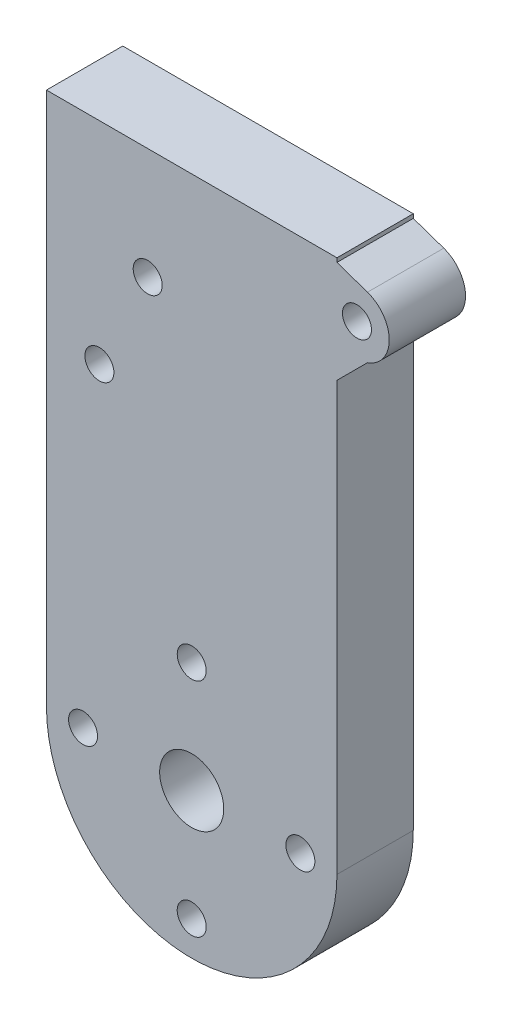
ISO-10303-21;
HEADER;
FILE_DESCRIPTION(('STEP AP214'),'2;1');
FILE_NAME('part.step','',(''),(''),'','','');
FILE_SCHEMA(('AUTOMOTIVE_DESIGN { 1 0 10303 214 1 1 1 1 }'));
ENDSEC;
DATA;
#1=APPLICATION_CONTEXT('core data for automotive mechanical design processes');
#2=APPLICATION_PROTOCOL_DEFINITION('international standard','automotive_design',2000,#1);
#3=PRODUCT_CONTEXT('',#1,'mechanical');
#4=PRODUCT('Part','Part','',(#3));
#5=PRODUCT_RELATED_PRODUCT_CATEGORY('part','',(#4));
#6=PRODUCT_DEFINITION_FORMATION('','',#4);
#7=PRODUCT_DEFINITION_CONTEXT('part definition',#1,'design');
#8=PRODUCT_DEFINITION('design','',#6,#7);
#9=PRODUCT_DEFINITION_SHAPE('','',#8);
#10=(LENGTH_UNIT() NAMED_UNIT(*) SI_UNIT(.MILLI.,.METRE.));
#11=(NAMED_UNIT(*) PLANE_ANGLE_UNIT() SI_UNIT($,.RADIAN.));
#12=(NAMED_UNIT(*) SI_UNIT($,.STERADIAN.) SOLID_ANGLE_UNIT());
#13=UNCERTAINTY_MEASURE_WITH_UNIT(LENGTH_MEASURE(1.E-05),#10,'distance_accuracy_value','');
#14=(GEOMETRIC_REPRESENTATION_CONTEXT(3) GLOBAL_UNCERTAINTY_ASSIGNED_CONTEXT((#13)) GLOBAL_UNIT_ASSIGNED_CONTEXT((#10,
#11,#12)) REPRESENTATION_CONTEXT('',''));
#15=CARTESIAN_POINT('',(0.,0.,0.));
#16=DIRECTION('',(0.,0.,1.));
#17=DIRECTION('',(1.,0.,0.));
#18=AXIS2_PLACEMENT_3D('',#15,#16,#17);
#19=CARTESIAN_POINT('',(-12.0999191944856,42.352384866158,10.));
#20=DIRECTION('',(0.,0.,-1.));
#21=DIRECTION('',(-1.,0.,0.));
#22=AXIS2_PLACEMENT_3D('',#19,#20,#21);
#23=CYLINDRICAL_SURFACE('',#22,1.9);
#24=CARTESIAN_POINT('',(-12.0999191944856,42.352384866158,10.));
#25=DIRECTION('',(0.,0.,1.));
#26=DIRECTION('',(1.,0.,0.));
#27=AXIS2_PLACEMENT_3D('',#24,#25,#26);
#28=CIRCLE('',#27,1.9);
#29=CARTESIAN_POINT('',(-10.1999191944856,42.352384866158,10.));
#30=VERTEX_POINT('',#29);
#31=EDGE_CURVE('E237',#30,#30,#28,.T.);
#32=ORIENTED_EDGE('',*,*,#31,.T.);
#33=EDGE_LOOP('',(#32));
#34=FACE_BOUND('',#33,.T.);
#35=CARTESIAN_POINT('',(-12.0999191944856,42.352384866158,2.));
#36=DIRECTION('',(0.,0.,-1.));
#37=DIRECTION('',(-1.,0.,0.));
#38=AXIS2_PLACEMENT_3D('',#35,#36,#37);
#39=CIRCLE('',#38,1.9);
#40=CARTESIAN_POINT('',(-13.9999191944856,42.352384866158,2.));
#41=VERTEX_POINT('',#40);
#42=EDGE_CURVE('E49',#41,#41,#39,.T.);
#43=ORIENTED_EDGE('',*,*,#42,.T.);
#44=EDGE_LOOP('',(#43));
#45=FACE_BOUND('',#44,.T.);
#46=ADVANCED_FACE('F45',(#34,#45),#23,.F.);
#47=CARTESIAN_POINT('',(-5.77203667010349,55.3987599472915,10.));
#48=DIRECTION('',(0.,0.,-1.));
#49=DIRECTION('',(-1.,0.,0.));
#50=AXIS2_PLACEMENT_3D('',#47,#48,#49);
#51=CYLINDRICAL_SURFACE('',#50,1.9);
#52=CARTESIAN_POINT('',(-5.77203667010349,55.3987599472915,10.));
#53=DIRECTION('',(0.,0.,1.));
#54=DIRECTION('',(1.,0.,0.));
#55=AXIS2_PLACEMENT_3D('',#52,#53,#54);
#56=CIRCLE('',#55,1.9);
#57=CARTESIAN_POINT('',(-3.87203667010349,55.3987599472915,10.));
#58=VERTEX_POINT('',#57);
#59=EDGE_CURVE('E233',#58,#58,#56,.T.);
#60=ORIENTED_EDGE('',*,*,#59,.T.);
#61=EDGE_LOOP('',(#60));
#62=FACE_BOUND('',#61,.T.);
#63=CARTESIAN_POINT('',(-5.77203667010349,55.3987599472915,2.));
#64=DIRECTION('',(0.,0.,-1.));
#65=DIRECTION('',(-1.,0.,0.));
#66=AXIS2_PLACEMENT_3D('',#63,#64,#65);
#67=CIRCLE('',#66,1.9);
#68=CARTESIAN_POINT('',(-7.6720366701035,55.3987599472915,2.));
#69=VERTEX_POINT('',#68);
#70=EDGE_CURVE('E194',#69,#69,#67,.T.);
#71=ORIENTED_EDGE('',*,*,#70,.T.);
#72=EDGE_LOOP('',(#71));
#73=FACE_BOUND('',#72,.T.);
#74=ADVANCED_FACE('F329',(#62,#73),#51,.F.);
#75=CARTESIAN_POINT('',(0.,0.,10.));
#76=DIRECTION('',(0.,0.,1.));
#77=DIRECTION('',(1.,0.,0.));
#78=AXIS2_PLACEMENT_3D('',#75,#76,#77);
#79=PLANE('',#78);
#80=ORIENTED_EDGE('',*,*,#31,.F.);
#81=EDGE_LOOP('',(#80));
#82=FACE_BOUND('',#81,.T.);
#83=CARTESIAN_POINT('',(0.,14.5378546269567,10.));
#84=DIRECTION('',(0.,0.,1.));
#85=DIRECTION('',(-1.,0.,0.));
#86=AXIS2_PLACEMENT_3D('',#83,#84,#85);
#87=CIRCLE('',#86,1.9);
#88=CARTESIAN_POINT('',(-1.89999999999998,14.5378546269567,10.));
#89=VERTEX_POINT('',#88);
#90=EDGE_CURVE('E250',#89,#89,#87,.T.);
#91=ORIENTED_EDGE('',*,*,#90,.F.);
#92=EDGE_LOOP('',(#91));
#93=FACE_BOUND('',#92,.T.);
#94=CARTESIAN_POINT('',(14.2426697614347,0.,10.));
#95=DIRECTION('',(0.,0.,1.));
#96=DIRECTION('',(-1.,0.,0.));
#97=AXIS2_PLACEMENT_3D('',#94,#95,#96);
#98=CIRCLE('',#97,1.9);
#99=CARTESIAN_POINT('',(12.3426697614347,0.,10.));
#100=VERTEX_POINT('',#99);
#101=EDGE_CURVE('E266',#100,#100,#98,.T.);
#102=ORIENTED_EDGE('',*,*,#101,.F.);
#103=EDGE_LOOP('',(#102));
#104=FACE_BOUND('',#103,.T.);
#105=CARTESIAN_POINT('',(-14.2426697614347,0.,10.));
#106=DIRECTION('',(0.,0.,1.));
#107=DIRECTION('',(1.,0.,0.));
#108=AXIS2_PLACEMENT_3D('',#105,#106,#107);
#109=CIRCLE('',#108,1.9);
#110=CARTESIAN_POINT('',(-12.3426697614347,0.,10.));
#111=VERTEX_POINT('',#110);
#112=EDGE_CURVE('E156',#111,#111,#109,.T.);
#113=ORIENTED_EDGE('',*,*,#112,.F.);
#114=EDGE_LOOP('',(#113));
#115=FACE_BOUND('',#114,.T.);
#116=CARTESIAN_POINT('',(0.,0.,10.));
#117=DIRECTION('',(0.,0.,1.));
#118=DIRECTION('',(1.,0.,0.));
#119=AXIS2_PLACEMENT_3D('',#116,#117,#118);
#120=CIRCLE('',#119,19.0388517538793);
#121=CARTESIAN_POINT('',(-19.0388517538793,0.,10.));
#122=VERTEX_POINT('',#121);
#123=CARTESIAN_POINT('',(19.0388517538793,0.,10.));
#124=VERTEX_POINT('',#123);
#125=EDGE_CURVE('E174',#122,#124,#120,.T.);
#126=ORIENTED_EDGE('',*,*,#125,.T.);
#127=DIRECTION('',(0.,1.,0.));
#128=VECTOR('',#127,1.);
#129=CARTESIAN_POINT('',(19.0388517538793,0.,10.));
#130=LINE('',#129,#128);
#131=CARTESIAN_POINT('',(19.0388517538793,56.0913366061646,10.));
#132=VERTEX_POINT('',#131);
#133=EDGE_CURVE('E109',#124,#132,#130,.T.);
#134=ORIENTED_EDGE('',*,*,#133,.T.);
#135=DIRECTION('',(0.707106781186539,0.707106781186556,0.));
#136=VECTOR('',#135,1.);
#137=CARTESIAN_POINT('',(23.0388517538793,60.0913366061647,10.));
#138=LINE('',#137,#136);
#139=CARTESIAN_POINT('',(23.0388517538793,60.0913366061647,10.));
#140=VERTEX_POINT('',#139);
#141=EDGE_CURVE('E291',#132,#140,#138,.T.);
#142=ORIENTED_EDGE('',*,*,#141,.T.);
#143=CARTESIAN_POINT('',(21.6608912166757,64.0913366061647,10.));
#144=DIRECTION('',(0.,0.,1.));
#145=DIRECTION('',(-1.,0.,0.));
#146=AXIS2_PLACEMENT_3D('',#143,#144,#145);
#147=CIRCLE('',#146,4.2306944160611);
#148=CARTESIAN_POINT('',(23.0388517538793,68.0913366061647,10.));
#149=VERTEX_POINT('',#148);
#150=EDGE_CURVE('E294',#140,#149,#147,.T.);
#151=ORIENTED_EDGE('',*,*,#150,.T.);
#152=DIRECTION('',(-0.945471264673407,0.32570552294499,0.));
#153=VECTOR('',#152,1.);
#154=CARTESIAN_POINT('',(19.0388517538793,69.4692971433683,10.));
#155=LINE('',#154,#153);
#156=CARTESIAN_POINT('',(19.0388517538793,69.4692971433683,10.));
#157=VERTEX_POINT('',#156);
#158=EDGE_CURVE('E129',#149,#157,#155,.T.);
#159=ORIENTED_EDGE('',*,*,#158,.T.);
#160=DIRECTION('',(0.,1.,0.));
#161=VECTOR('',#160,1.);
#162=CARTESIAN_POINT('',(19.0388517538793,69.4692971433683,10.));
#163=LINE('',#162,#161);
#164=CARTESIAN_POINT('',(19.0388517538793,70.,10.));
#165=VERTEX_POINT('',#164);
#166=EDGE_CURVE('E122',#157,#165,#163,.T.);
#167=ORIENTED_EDGE('',*,*,#166,.T.);
#168=DIRECTION('',(-1.,0.,0.));
#169=VECTOR('',#168,1.);
#170=CARTESIAN_POINT('',(19.0388517538793,70.,10.));
#171=LINE('',#170,#169);
#172=CARTESIAN_POINT('',(-19.0388517538793,70.,10.));
#173=VERTEX_POINT('',#172);
#174=EDGE_CURVE('E127',#165,#173,#171,.T.);
#175=ORIENTED_EDGE('',*,*,#174,.T.);
#176=DIRECTION('',(0.,-1.,0.));
#177=VECTOR('',#176,1.);
#178=CARTESIAN_POINT('',(-19.0388517538793,0.,10.));
#179=LINE('',#178,#177);
#180=EDGE_CURVE('E65',#173,#122,#179,.T.);
#181=ORIENTED_EDGE('',*,*,#180,.T.);
#182=EDGE_LOOP('',(#126,#134,#142,#151,#159,#167,#175,#181));
#183=FACE_BOUND('',#182,.T.);
#184=CARTESIAN_POINT('',(0.,0.,10.));
#185=DIRECTION('',(0.,0.,1.));
#186=DIRECTION('',(1.,0.,0.));
#187=AXIS2_PLACEMENT_3D('',#184,#185,#186);
#188=CIRCLE('',#187,4.2);
#189=CARTESIAN_POINT('',(4.2,0.,10.));
#190=VERTEX_POINT('',#189);
#191=EDGE_CURVE('E270',#190,#190,#188,.T.);
#192=ORIENTED_EDGE('',*,*,#191,.F.);
#193=EDGE_LOOP('',(#192));
#194=FACE_BOUND('',#193,.T.);
#195=CARTESIAN_POINT('',(0.,-14.5378546269567,10.));
#196=DIRECTION('',(0.,0.,1.));
#197=DIRECTION('',(1.,0.,0.));
#198=AXIS2_PLACEMENT_3D('',#195,#196,#197);
#199=CIRCLE('',#198,1.9);
#200=CARTESIAN_POINT('',(1.9,-14.5378546269567,10.));
#201=VERTEX_POINT('',#200);
#202=EDGE_CURVE('E258',#201,#201,#199,.T.);
#203=ORIENTED_EDGE('',*,*,#202,.F.);
#204=EDGE_LOOP('',(#203));
#205=FACE_BOUND('',#204,.T.);
#206=CARTESIAN_POINT('',(21.6608912166757,64.0913366061647,10.));
#207=DIRECTION('',(0.,0.,1.));
#208=DIRECTION('',(1.,0.,0.));
#209=AXIS2_PLACEMENT_3D('',#206,#207,#208);
#210=CIRCLE('',#209,1.9);
#211=CARTESIAN_POINT('',(23.5608912166757,64.0913366061647,10.));
#212=VERTEX_POINT('',#211);
#213=EDGE_CURVE('E242',#212,#212,#210,.T.);
#214=ORIENTED_EDGE('',*,*,#213,.F.);
#215=EDGE_LOOP('',(#214));
#216=FACE_BOUND('',#215,.T.);
#217=ORIENTED_EDGE('',*,*,#59,.F.);
#218=EDGE_LOOP('',(#217));
#219=FACE_BOUND('',#218,.T.);
#220=ADVANCED_FACE('F124',(#82,#93,#104,#115,#183,#194,#205,#216,#219),#79,.T.);
#221=CARTESIAN_POINT('',(0.,0.,0.));
#222=DIRECTION('',(0.,0.,1.));
#223=DIRECTION('',(1.,0.,0.));
#224=AXIS2_PLACEMENT_3D('',#221,#222,#223);
#225=PLANE('',#224);
#226=CARTESIAN_POINT('',(-12.0999191944856,42.352384866158,0.));
#227=DIRECTION('',(0.,0.,-1.));
#228=DIRECTION('',(-1.,0.,0.));
#229=AXIS2_PLACEMENT_3D('',#226,#227,#228);
#230=CIRCLE('',#229,2.9);
#231=CARTESIAN_POINT('',(-14.9999191944856,42.352384866158,0.));
#232=VERTEX_POINT('',#231);
#233=EDGE_CURVE('E205',#232,#232,#230,.T.);
#234=ORIENTED_EDGE('',*,*,#233,.F.);
#235=EDGE_LOOP('',(#234));
#236=FACE_BOUND('',#235,.T.);
#237=CARTESIAN_POINT('',(-5.77203667010349,55.3987599472915,0.));
#238=DIRECTION('',(0.,0.,-1.));
#239=DIRECTION('',(-1.,0.,0.));
#240=AXIS2_PLACEMENT_3D('',#237,#238,#239);
#241=CIRCLE('',#240,2.9);
#242=CARTESIAN_POINT('',(-8.67203667010349,55.3987599472915,0.));
#243=VERTEX_POINT('',#242);
#244=EDGE_CURVE('E211',#243,#243,#241,.T.);
#245=ORIENTED_EDGE('',*,*,#244,.F.);
#246=EDGE_LOOP('',(#245));
#247=FACE_BOUND('',#246,.T.);
#248=CARTESIAN_POINT('',(0.,0.,0.));
#249=DIRECTION('',(0.,0.,1.));
#250=DIRECTION('',(1.,0.,0.));
#251=AXIS2_PLACEMENT_3D('',#248,#249,#250);
#252=CIRCLE('',#251,12.);
#253=CARTESIAN_POINT('',(12.,0.,0.));
#254=VERTEX_POINT('',#253);
#255=EDGE_CURVE('E11',#254,#254,#252,.F.);
#256=ORIENTED_EDGE('',*,*,#255,.F.);
#257=EDGE_LOOP('',(#256));
#258=FACE_BOUND('',#257,.T.);
#259=CARTESIAN_POINT('',(0.,0.,0.));
#260=DIRECTION('',(0.,0.,1.));
#261=DIRECTION('',(1.,0.,0.));
#262=AXIS2_PLACEMENT_3D('',#259,#260,#261);
#263=CIRCLE('',#262,19.0388517538793);
#264=CARTESIAN_POINT('',(-19.0388517538793,0.,0.));
#265=VERTEX_POINT('',#264);
#266=CARTESIAN_POINT('',(19.0388517538793,0.,0.));
#267=VERTEX_POINT('',#266);
#268=EDGE_CURVE('E151',#265,#267,#263,.T.);
#269=ORIENTED_EDGE('',*,*,#268,.F.);
#270=DIRECTION('',(0.,-1.,0.));
#271=VECTOR('',#270,1.);
#272=CARTESIAN_POINT('',(-19.0388517538793,0.,0.));
#273=LINE('',#272,#271);
#274=CARTESIAN_POINT('',(-19.0388517538793,70.,0.));
#275=VERTEX_POINT('',#274);
#276=EDGE_CURVE('E100',#275,#265,#273,.T.);
#277=ORIENTED_EDGE('',*,*,#276,.F.);
#278=DIRECTION('',(-1.,0.,0.));
#279=VECTOR('',#278,1.);
#280=CARTESIAN_POINT('',(19.0388517538793,70.,0.));
#281=LINE('',#280,#279);
#282=CARTESIAN_POINT('',(19.0388517538793,70.,0.));
#283=VERTEX_POINT('',#282);
#284=EDGE_CURVE('E94',#283,#275,#281,.T.);
#285=ORIENTED_EDGE('',*,*,#284,.F.);
#286=DIRECTION('',(0.,1.,0.));
#287=VECTOR('',#286,1.);
#288=CARTESIAN_POINT('',(19.0388517538793,69.4692971433683,0.));
#289=LINE('',#288,#287);
#290=CARTESIAN_POINT('',(19.0388517538793,69.4692971433683,0.));
#291=VERTEX_POINT('',#290);
#292=EDGE_CURVE('E138',#291,#283,#289,.T.);
#293=ORIENTED_EDGE('',*,*,#292,.F.);
#294=DIRECTION('',(-0.945471264673407,0.32570552294499,0.));
#295=VECTOR('',#294,1.);
#296=CARTESIAN_POINT('',(19.0388517538793,69.4692971433683,0.));
#297=LINE('',#296,#295);
#298=CARTESIAN_POINT('',(23.0388517538793,68.0913366061647,0.));
#299=VERTEX_POINT('',#298);
#300=EDGE_CURVE('E165',#299,#291,#297,.T.);
#301=ORIENTED_EDGE('',*,*,#300,.F.);
#302=CARTESIAN_POINT('',(21.6608912166757,64.0913366061647,0.));
#303=DIRECTION('',(0.,0.,1.));
#304=DIRECTION('',(-1.,0.,0.));
#305=AXIS2_PLACEMENT_3D('',#302,#303,#304);
#306=CIRCLE('',#305,4.2306944160611);
#307=CARTESIAN_POINT('',(23.0388517538793,60.0913366061647,0.));
#308=VERTEX_POINT('',#307);
#309=EDGE_CURVE('E162',#308,#299,#306,.T.);
#310=ORIENTED_EDGE('',*,*,#309,.F.);
#311=DIRECTION('',(0.707106781186539,0.707106781186556,0.));
#312=VECTOR('',#311,1.);
#313=CARTESIAN_POINT('',(23.0388517538793,60.0913366061647,0.));
#314=LINE('',#313,#312);
#315=CARTESIAN_POINT('',(19.0388517538793,56.0913366061646,0.));
#316=VERTEX_POINT('',#315);
#317=EDGE_CURVE('E159',#316,#308,#314,.T.);
#318=ORIENTED_EDGE('',*,*,#317,.F.);
#319=DIRECTION('',(0.,1.,0.));
#320=VECTOR('',#319,1.);
#321=CARTESIAN_POINT('',(19.0388517538793,0.,0.));
#322=LINE('',#321,#320);
#323=EDGE_CURVE('E155',#267,#316,#322,.T.);
#324=ORIENTED_EDGE('',*,*,#323,.F.);
#325=EDGE_LOOP('',(#269,#277,#285,#293,#301,#310,#318,#324));
#326=FACE_BOUND('',#325,.T.);
#327=CARTESIAN_POINT('',(-14.2426697614347,0.,0.));
#328=DIRECTION('',(0.,0.,1.));
#329=DIRECTION('',(1.,0.,0.));
#330=AXIS2_PLACEMENT_3D('',#327,#328,#329);
#331=CIRCLE('',#330,1.9);
#332=CARTESIAN_POINT('',(-12.3426697614347,0.,0.));
#333=VERTEX_POINT('',#332);
#334=EDGE_CURVE('E277',#333,#333,#331,.T.);
#335=ORIENTED_EDGE('',*,*,#334,.T.);
#336=EDGE_LOOP('',(#335));
#337=FACE_BOUND('',#336,.T.);
#338=CARTESIAN_POINT('',(14.2426697614347,0.,0.));
#339=DIRECTION('',(0.,0.,1.));
#340=DIRECTION('',(-1.,0.,0.));
#341=AXIS2_PLACEMENT_3D('',#338,#339,#340);
#342=CIRCLE('',#341,1.9);
#343=CARTESIAN_POINT('',(12.3426697614347,0.,0.));
#344=VERTEX_POINT('',#343);
#345=EDGE_CURVE('E262',#344,#344,#342,.T.);
#346=ORIENTED_EDGE('',*,*,#345,.T.);
#347=EDGE_LOOP('',(#346));
#348=FACE_BOUND('',#347,.T.);
#349=CARTESIAN_POINT('',(0.,-14.5378546269567,0.));
#350=DIRECTION('',(0.,0.,1.));
#351=DIRECTION('',(1.,0.,0.));
#352=AXIS2_PLACEMENT_3D('',#349,#350,#351);
#353=CIRCLE('',#352,1.9);
#354=CARTESIAN_POINT('',(1.9,-14.5378546269567,0.));
#355=VERTEX_POINT('',#354);
#356=EDGE_CURVE('E254',#355,#355,#353,.T.);
#357=ORIENTED_EDGE('',*,*,#356,.T.);
#358=EDGE_LOOP('',(#357));
#359=FACE_BOUND('',#358,.T.);
#360=CARTESIAN_POINT('',(0.,14.5378546269567,0.));
#361=DIRECTION('',(0.,0.,1.));
#362=DIRECTION('',(-1.,0.,0.));
#363=AXIS2_PLACEMENT_3D('',#360,#361,#362);
#364=CIRCLE('',#363,1.9);
#365=CARTESIAN_POINT('',(-1.89999999999998,14.5378546269567,0.));
#366=VERTEX_POINT('',#365);
#367=EDGE_CURVE('E246',#366,#366,#364,.T.);
#368=ORIENTED_EDGE('',*,*,#367,.T.);
#369=EDGE_LOOP('',(#368));
#370=FACE_BOUND('',#369,.T.);
#371=CARTESIAN_POINT('',(21.6608912166757,64.0913366061647,0.));
#372=DIRECTION('',(0.,0.,1.));
#373=DIRECTION('',(1.,0.,0.));
#374=AXIS2_PLACEMENT_3D('',#371,#372,#373);
#375=CIRCLE('',#374,1.9);
#376=CARTESIAN_POINT('',(23.5608912166757,64.0913366061647,0.));
#377=VERTEX_POINT('',#376);
#378=EDGE_CURVE('E241',#377,#377,#375,.T.);
#379=ORIENTED_EDGE('',*,*,#378,.T.);
#380=EDGE_LOOP('',(#379));
#381=FACE_BOUND('',#380,.T.);
#382=ADVANCED_FACE('F309',(#236,#247,#258,#326,#337,#348,#359,#370,#381),#225,.F.);
#383=CARTESIAN_POINT('',(0.,0.,10.));
#384=DIRECTION('',(0.,0.,-1.));
#385=DIRECTION('',(-1.,0.,0.));
#386=AXIS2_PLACEMENT_3D('',#383,#384,#385);
#387=CYLINDRICAL_SURFACE('',#386,19.0388517538793);
#388=ORIENTED_EDGE('',*,*,#268,.T.);
#389=DIRECTION('',(0.,0.,-1.));
#390=VECTOR('',#389,1.);
#391=CARTESIAN_POINT('',(19.0388517538793,0.,10.));
#392=LINE('',#391,#390);
#393=EDGE_CURVE('E56',#124,#267,#392,.T.);
#394=ORIENTED_EDGE('',*,*,#393,.F.);
#395=ORIENTED_EDGE('',*,*,#125,.F.);
#396=DIRECTION('',(0.,0.,-1.));
#397=VECTOR('',#396,1.);
#398=CARTESIAN_POINT('',(-19.0388517538793,0.,10.));
#399=LINE('',#398,#397);
#400=EDGE_CURVE('E147',#122,#265,#399,.T.);
#401=ORIENTED_EDGE('',*,*,#400,.T.);
#402=EDGE_LOOP('',(#388,#394,#395,#401));
#403=FACE_BOUND('',#402,.T.);
#404=ADVANCED_FACE('F47',(#403),#387,.T.);
#405=CARTESIAN_POINT('',(19.0388517538793,0.,10.));
#406=DIRECTION('',(-1.,0.,0.));
#407=DIRECTION('',(0.,0.,1.));
#408=AXIS2_PLACEMENT_3D('',#405,#406,#407);
#409=PLANE('',#408);
#410=ORIENTED_EDGE('',*,*,#323,.T.);
#411=DIRECTION('',(0.,0.,-1.));
#412=VECTOR('',#411,1.);
#413=CARTESIAN_POINT('',(19.0388517538793,56.0913366061646,10.));
#414=LINE('',#413,#412);
#415=EDGE_CURVE('E189',#132,#316,#414,.T.);
#416=ORIENTED_EDGE('',*,*,#415,.F.);
#417=ORIENTED_EDGE('',*,*,#133,.F.);
#418=ORIENTED_EDGE('',*,*,#393,.T.);
#419=EDGE_LOOP('',(#410,#416,#417,#418));
#420=FACE_BOUND('',#419,.T.);
#421=ADVANCED_FACE('F369',(#420),#409,.F.);
#422=CARTESIAN_POINT('',(23.0388517538793,60.0913366061647,10.));
#423=DIRECTION('',(-0.707106781186556,0.707106781186539,0.));
#424=DIRECTION('',(-0.707106781186539,-0.707106781186556,0.));
#425=AXIS2_PLACEMENT_3D('',#422,#423,#424);
#426=PLANE('',#425);
#427=ORIENTED_EDGE('',*,*,#317,.T.);
#428=DIRECTION('',(0.,0.,-1.));
#429=VECTOR('',#428,1.);
#430=CARTESIAN_POINT('',(23.0388517538793,60.0913366061647,10.));
#431=LINE('',#430,#429);
#432=EDGE_CURVE('E185',#140,#308,#431,.T.);
#433=ORIENTED_EDGE('',*,*,#432,.F.);
#434=ORIENTED_EDGE('',*,*,#141,.F.);
#435=ORIENTED_EDGE('',*,*,#415,.T.);
#436=EDGE_LOOP('',(#427,#433,#434,#435));
#437=FACE_BOUND('',#436,.T.);
#438=ADVANCED_FACE('F528',(#437),#426,.F.);
#439=CARTESIAN_POINT('',(21.6608912166757,64.0913366061647,10.));
#440=DIRECTION('',(0.,0.,-1.));
#441=DIRECTION('',(-1.,0.,0.));
#442=AXIS2_PLACEMENT_3D('',#439,#440,#441);
#443=CYLINDRICAL_SURFACE('',#442,4.2306944160611);
#444=ORIENTED_EDGE('',*,*,#309,.T.);
#445=DIRECTION('',(0.,0.,-1.));
#446=VECTOR('',#445,1.);
#447=CARTESIAN_POINT('',(23.0388517538793,68.0913366061647,10.));
#448=LINE('',#447,#446);
#449=EDGE_CURVE('E181',#149,#299,#448,.T.);
#450=ORIENTED_EDGE('',*,*,#449,.F.);
#451=ORIENTED_EDGE('',*,*,#150,.F.);
#452=ORIENTED_EDGE('',*,*,#432,.T.);
#453=EDGE_LOOP('',(#444,#450,#451,#452));
#454=FACE_BOUND('',#453,.T.);
#455=ADVANCED_FACE('F302',(#454),#443,.T.);
#456=CARTESIAN_POINT('',(19.0388517538793,69.4692971433683,10.));
#457=DIRECTION('',(-0.32570552294499,-0.945471264673407,0.));
#458=DIRECTION('',(0.945471264673407,-0.32570552294499,0.));
#459=AXIS2_PLACEMENT_3D('',#456,#457,#458);
#460=PLANE('',#459);
#461=ORIENTED_EDGE('',*,*,#300,.T.);
#462=DIRECTION('',(0.,0.,-1.));
#463=VECTOR('',#462,1.);
#464=CARTESIAN_POINT('',(19.0388517538793,69.4692971433683,10.));
#465=LINE('',#464,#463);
#466=EDGE_CURVE('E140',#157,#291,#465,.T.);
#467=ORIENTED_EDGE('',*,*,#466,.F.);
#468=ORIENTED_EDGE('',*,*,#158,.F.);
#469=ORIENTED_EDGE('',*,*,#449,.T.);
#470=EDGE_LOOP('',(#461,#467,#468,#469));
#471=FACE_BOUND('',#470,.T.);
#472=ADVANCED_FACE('F306',(#471),#460,.F.);
#473=CARTESIAN_POINT('',(19.0388517538793,69.4692971433683,10.));
#474=DIRECTION('',(-1.,0.,0.));
#475=DIRECTION('',(0.,0.,1.));
#476=AXIS2_PLACEMENT_3D('',#473,#474,#475);
#477=PLANE('',#476);
#478=ORIENTED_EDGE('',*,*,#292,.T.);
#479=DIRECTION('',(0.,0.,-1.));
#480=VECTOR('',#479,1.);
#481=CARTESIAN_POINT('',(19.0388517538793,70.,10.));
#482=LINE('',#481,#480);
#483=EDGE_CURVE('E135',#165,#283,#482,.T.);
#484=ORIENTED_EDGE('',*,*,#483,.F.);
#485=ORIENTED_EDGE('',*,*,#166,.F.);
#486=ORIENTED_EDGE('',*,*,#466,.T.);
#487=EDGE_LOOP('',(#478,#484,#485,#486));
#488=FACE_BOUND('',#487,.T.);
#489=ADVANCED_FACE('F136',(#488),#477,.F.);
#490=CARTESIAN_POINT('',(19.0388517538793,70.,10.));
#491=DIRECTION('',(0.,-1.,0.));
#492=DIRECTION('',(0.,0.,-1.));
#493=AXIS2_PLACEMENT_3D('',#490,#491,#492);
#494=PLANE('',#493);
#495=ORIENTED_EDGE('',*,*,#284,.T.);
#496=DIRECTION('',(0.,0.,-1.));
#497=VECTOR('',#496,1.);
#498=CARTESIAN_POINT('',(-19.0388517538793,70.,10.));
#499=LINE('',#498,#497);
#500=EDGE_CURVE('E141',#173,#275,#499,.T.);
#501=ORIENTED_EDGE('',*,*,#500,.F.);
#502=ORIENTED_EDGE('',*,*,#174,.F.);
#503=ORIENTED_EDGE('',*,*,#483,.T.);
#504=EDGE_LOOP('',(#495,#501,#502,#503));
#505=FACE_BOUND('',#504,.T.);
#506=ADVANCED_FACE('F143',(#505),#494,.F.);
#507=CARTESIAN_POINT('',(-19.0388517538793,0.,10.));
#508=DIRECTION('',(1.,0.,0.));
#509=DIRECTION('',(0.,0.,-1.));
#510=AXIS2_PLACEMENT_3D('',#507,#508,#509);
#511=PLANE('',#510);
#512=ORIENTED_EDGE('',*,*,#276,.T.);
#513=ORIENTED_EDGE('',*,*,#400,.F.);
#514=ORIENTED_EDGE('',*,*,#180,.F.);
#515=ORIENTED_EDGE('',*,*,#500,.T.);
#516=EDGE_LOOP('',(#512,#513,#514,#515));
#517=FACE_BOUND('',#516,.T.);
#518=ADVANCED_FACE('F315',(#517),#511,.F.);
#519=CARTESIAN_POINT('',(-14.2426697614347,0.,10.));
#520=DIRECTION('',(0.,0.,-1.));
#521=DIRECTION('',(-1.,0.,0.));
#522=AXIS2_PLACEMENT_3D('',#519,#520,#521);
#523=CYLINDRICAL_SURFACE('',#522,1.9);
#524=ORIENTED_EDGE('',*,*,#112,.T.);
#525=EDGE_LOOP('',(#524));
#526=FACE_BOUND('',#525,.T.);
#527=ORIENTED_EDGE('',*,*,#334,.F.);
#528=EDGE_LOOP('',(#527));
#529=FACE_BOUND('',#528,.T.);
#530=ADVANCED_FACE('F317',(#526,#529),#523,.F.);
#531=CARTESIAN_POINT('',(0.,0.,10.));
#532=DIRECTION('',(0.,0.,-1.));
#533=DIRECTION('',(-1.,0.,0.));
#534=AXIS2_PLACEMENT_3D('',#531,#532,#533);
#535=CYLINDRICAL_SURFACE('',#534,4.2);
#536=ORIENTED_EDGE('',*,*,#191,.T.);
#537=EDGE_LOOP('',(#536));
#538=FACE_BOUND('',#537,.T.);
#539=CARTESIAN_POINT('',(0.,0.,0.));
#540=DIRECTION('',(0.,0.,1.));
#541=DIRECTION('',(1.,0.,0.));
#542=AXIS2_PLACEMENT_3D('',#539,#540,#541);
#543=CIRCLE('',#542,4.2);
#544=CARTESIAN_POINT('',(4.2,0.,0.));
#545=VERTEX_POINT('',#544);
#546=EDGE_CURVE('E225',#545,#545,#543,.T.);
#547=ORIENTED_EDGE('',*,*,#546,.F.);
#548=EDGE_LOOP('',(#547));
#549=FACE_BOUND('',#548,.T.);
#550=ADVANCED_FACE('F323',(#538,#549),#535,.F.);
#551=CARTESIAN_POINT('',(14.2426697614347,0.,10.));
#552=DIRECTION('',(0.,0.,-1.));
#553=DIRECTION('',(-1.,0.,0.));
#554=AXIS2_PLACEMENT_3D('',#551,#552,#553);
#555=CYLINDRICAL_SURFACE('',#554,1.9);
#556=ORIENTED_EDGE('',*,*,#101,.T.);
#557=EDGE_LOOP('',(#556));
#558=FACE_BOUND('',#557,.T.);
#559=ORIENTED_EDGE('',*,*,#345,.F.);
#560=EDGE_LOOP('',(#559));
#561=FACE_BOUND('',#560,.T.);
#562=ADVANCED_FACE('F353',(#558,#561),#555,.F.);
#563=CARTESIAN_POINT('',(0.,-14.5378546269567,10.));
#564=DIRECTION('',(0.,0.,-1.));
#565=DIRECTION('',(-1.,0.,0.));
#566=AXIS2_PLACEMENT_3D('',#563,#564,#565);
#567=CYLINDRICAL_SURFACE('',#566,1.9);
#568=ORIENTED_EDGE('',*,*,#202,.T.);
#569=EDGE_LOOP('',(#568));
#570=FACE_BOUND('',#569,.T.);
#571=ORIENTED_EDGE('',*,*,#356,.F.);
#572=EDGE_LOOP('',(#571));
#573=FACE_BOUND('',#572,.T.);
#574=ADVANCED_FACE('F349',(#570,#573),#567,.F.);
#575=CARTESIAN_POINT('',(0.,14.5378546269567,10.));
#576=DIRECTION('',(0.,0.,-1.));
#577=DIRECTION('',(-1.,0.,0.));
#578=AXIS2_PLACEMENT_3D('',#575,#576,#577);
#579=CYLINDRICAL_SURFACE('',#578,1.9);
#580=ORIENTED_EDGE('',*,*,#90,.T.);
#581=EDGE_LOOP('',(#580));
#582=FACE_BOUND('',#581,.T.);
#583=ORIENTED_EDGE('',*,*,#367,.F.);
#584=EDGE_LOOP('',(#583));
#585=FACE_BOUND('',#584,.T.);
#586=ADVANCED_FACE('F345',(#582,#585),#579,.F.);
#587=CARTESIAN_POINT('',(21.6608912166757,64.0913366061647,10.));
#588=DIRECTION('',(0.,0.,-1.));
#589=DIRECTION('',(-1.,0.,0.));
#590=AXIS2_PLACEMENT_3D('',#587,#588,#589);
#591=CYLINDRICAL_SURFACE('',#590,1.9);
#592=ORIENTED_EDGE('',*,*,#213,.T.);
#593=EDGE_LOOP('',(#592));
#594=FACE_BOUND('',#593,.T.);
#595=ORIENTED_EDGE('',*,*,#378,.F.);
#596=EDGE_LOOP('',(#595));
#597=FACE_BOUND('',#596,.T.);
#598=ADVANCED_FACE('F341',(#594,#597),#591,.F.);
#599=CARTESIAN_POINT('',(0.,0.,-7.));
#600=DIRECTION('',(0.,0.,1.));
#601=DIRECTION('',(1.,0.,0.));
#602=AXIS2_PLACEMENT_3D('',#599,#600,#601);
#603=CYLINDRICAL_SURFACE('',#602,12.);
#604=CARTESIAN_POINT('',(0.,0.,-7.));
#605=DIRECTION('',(0.,0.,-1.));
#606=DIRECTION('',(-1.,0.,0.));
#607=AXIS2_PLACEMENT_3D('',#604,#605,#606);
#608=CIRCLE('',#607,12.);
#609=CARTESIAN_POINT('',(12.,0.,-7.));
#610=VERTEX_POINT('',#609);
#611=EDGE_CURVE('E229',#610,#610,#608,.T.);
#612=CARTESIAN_POINT('',(12.,0.,-7.));
#613=CARTESIAN_POINT('',(12.,0.,-6.92708333333333));
#614=CARTESIAN_POINT('',(12.,0.,-6.85416666666667));
#615=CARTESIAN_POINT('',(12.,0.,-6.70833333333333));
#616=CARTESIAN_POINT('',(12.,0.,-6.63541666666667));
#617=CARTESIAN_POINT('',(12.,0.,-6.48958333333333));
#618=CARTESIAN_POINT('',(12.,0.,-6.41666666666667));
#619=CARTESIAN_POINT('',(12.,0.,-6.27083333333333));
#620=CARTESIAN_POINT('',(12.,0.,-6.19791666666667));
#621=CARTESIAN_POINT('',(12.,0.,-6.05208333333333));
#622=CARTESIAN_POINT('',(12.,0.,-5.97916666666667));
#623=CARTESIAN_POINT('',(12.,0.,-5.83333333333333));
#624=CARTESIAN_POINT('',(12.,0.,-5.76041666666667));
#625=CARTESIAN_POINT('',(12.,0.,-5.61458333333333));
#626=CARTESIAN_POINT('',(12.,0.,-5.54166666666667));
#627=CARTESIAN_POINT('',(12.,0.,-5.39583333333333));
#628=CARTESIAN_POINT('',(12.,0.,-5.32291666666667));
#629=CARTESIAN_POINT('',(12.,0.,-5.17708333333333));
#630=CARTESIAN_POINT('',(12.,0.,-5.10416666666667));
#631=CARTESIAN_POINT('',(12.,0.,-4.95833333333333));
#632=CARTESIAN_POINT('',(12.,0.,-4.88541666666667));
#633=CARTESIAN_POINT('',(12.,0.,-4.73958333333333));
#634=CARTESIAN_POINT('',(12.,0.,-4.66666666666667));
#635=CARTESIAN_POINT('',(12.,0.,-4.52083333333333));
#636=CARTESIAN_POINT('',(12.,0.,-4.44791666666667));
#637=CARTESIAN_POINT('',(12.,0.,-4.30208333333333));
#638=CARTESIAN_POINT('',(12.,0.,-4.22916666666667));
#639=CARTESIAN_POINT('',(12.,0.,-4.08333333333333));
#640=CARTESIAN_POINT('',(12.,0.,-4.01041666666667));
#641=CARTESIAN_POINT('',(12.,0.,-3.86458333333333));
#642=CARTESIAN_POINT('',(12.,0.,-3.79166666666667));
#643=CARTESIAN_POINT('',(12.,0.,-3.64583333333333));
#644=CARTESIAN_POINT('',(12.,0.,-3.57291666666667));
#645=CARTESIAN_POINT('',(12.,0.,-3.42708333333333));
#646=CARTESIAN_POINT('',(12.,0.,-3.35416666666667));
#647=CARTESIAN_POINT('',(12.,0.,-3.20833333333333));
#648=CARTESIAN_POINT('',(12.,0.,-3.13541666666667));
#649=CARTESIAN_POINT('',(12.,0.,-2.98958333333333));
#650=CARTESIAN_POINT('',(12.,0.,-2.91666666666667));
#651=CARTESIAN_POINT('',(12.,0.,-2.77083333333333));
#652=CARTESIAN_POINT('',(12.,0.,-2.69791666666667));
#653=CARTESIAN_POINT('',(12.,0.,-2.55208333333333));
#654=CARTESIAN_POINT('',(12.,0.,-2.47916666666667));
#655=CARTESIAN_POINT('',(12.,0.,-2.33333333333333));
#656=CARTESIAN_POINT('',(12.,0.,-2.26041666666667));
#657=CARTESIAN_POINT('',(12.,0.,-2.11458333333333));
#658=CARTESIAN_POINT('',(12.,0.,-2.04166666666667));
#659=CARTESIAN_POINT('',(12.,0.,-1.89583333333333));
#660=CARTESIAN_POINT('',(12.,0.,-1.82291666666667));
#661=CARTESIAN_POINT('',(12.,0.,-1.67708333333333));
#662=CARTESIAN_POINT('',(12.,0.,-1.60416666666667));
#663=CARTESIAN_POINT('',(12.,0.,-1.45833333333333));
#664=CARTESIAN_POINT('',(12.,0.,-1.38541666666667));
#665=CARTESIAN_POINT('',(12.,0.,-1.23958333333333));
#666=CARTESIAN_POINT('',(12.,0.,-1.16666666666667));
#667=CARTESIAN_POINT('',(12.,0.,-1.02083333333333));
#668=CARTESIAN_POINT('',(12.,0.,-0.947916666666667));
#669=CARTESIAN_POINT('',(12.,0.,-0.802083333333334));
#670=CARTESIAN_POINT('',(12.,0.,-0.729166666666667));
#671=CARTESIAN_POINT('',(12.,0.,-0.583333333333334));
#672=CARTESIAN_POINT('',(12.,0.,-0.510416666666667));
#673=CARTESIAN_POINT('',(12.,0.,-0.364583333333334));
#674=CARTESIAN_POINT('',(12.,0.,-0.291666666666668));
#675=CARTESIAN_POINT('',(12.,0.,-0.145833333333334));
#676=CARTESIAN_POINT('',(12.,0.,-0.0729166666666675));
#677=CARTESIAN_POINT('',(12.,0.,0.));
#678=B_SPLINE_CURVE_WITH_KNOTS('',3,(#612,#613,#614,#615,#616,#617,#618,#619,#620,#621,#622,
#623,#624,#625,#626,#627,#628,#629,#630,#631,#632,#633,#634,#635,#636,#637,#638,#639,#640,#641,
#642,#643,#644,#645,#646,#647,#648,#649,#650,#651,#652,#653,#654,#655,#656,#657,#658,#659,#660,
#661,#662,#663,#664,#665,#666,#667,#668,#669,#670,#671,#672,#673,#674,#675,#676,#677),
.UNSPECIFIED.,.F.,.F.,(4,2,2,2,2,2,2,2,2,2,2,2,2,2,2,2,2,2,2,2,2,2,2,2,2,2,2,2,2,2,2,2,4),(0.,
0.218749999999999,0.4375,0.65625,0.874999999999999,1.09375,1.3125,1.53125,1.75,1.96875,2.1875,
2.40625,2.625,2.84375,3.0625,3.28125,3.5,3.71875,3.9375,4.15625,4.375,4.59375,4.8125,5.03125,
5.25,5.46875,5.6875,5.90625,6.125,6.34375,6.5625,6.78125,7.),.UNSPECIFIED.);
#679=EDGE_CURVE('BSEAM344',#610,#254,#678,.T.);
#680=ORIENTED_EDGE('',*,*,#611,.F.);
#681=ORIENTED_EDGE('',*,*,#255,.T.);
#682=ORIENTED_EDGE('',*,*,#679,.T.);
#683=ORIENTED_EDGE('',*,*,#679,.F.);
#684=EDGE_LOOP('',(#680,#682,#681,#683));
#685=FACE_BOUND('',#684,.T.);
#686=ADVANCED_FACE('F344',(#685),#603,.T.);
#687=CARTESIAN_POINT('',(0.,0.,-7.));
#688=DIRECTION('',(0.,0.,-1.));
#689=DIRECTION('',(-1.,0.,0.));
#690=AXIS2_PLACEMENT_3D('',#687,#688,#689);
#691=PLANE('',#690);
#692=CARTESIAN_POINT('',(0.,0.,-7.));
#693=DIRECTION('',(0.,0.,-1.));
#694=DIRECTION('',(-1.,0.,0.));
#695=AXIS2_PLACEMENT_3D('',#692,#693,#694);
#696=CIRCLE('',#695,11.2);
#697=CARTESIAN_POINT('',(-11.2,0.,-7.));
#698=VERTEX_POINT('',#697);
#699=EDGE_CURVE('E203',#698,#698,#696,.T.);
#700=ORIENTED_EDGE('',*,*,#699,.F.);
#701=EDGE_LOOP('',(#700));
#702=FACE_BOUND('',#701,.T.);
#703=ORIENTED_EDGE('',*,*,#611,.T.);
#704=EDGE_LOOP('',(#703));
#705=FACE_BOUND('',#704,.T.);
#706=ADVANCED_FACE('F377',(#702,#705),#691,.T.);
#707=CARTESIAN_POINT('',(0.,0.,0.));
#708=DIRECTION('',(0.,0.,-1.));
#709=DIRECTION('',(-1.,0.,0.));
#710=AXIS2_PLACEMENT_3D('',#707,#708,#709);
#711=PLANE('',#710);
#712=CARTESIAN_POINT('',(0.,0.,0.));
#713=DIRECTION('',(0.,0.,-1.));
#714=DIRECTION('',(-1.,0.,0.));
#715=AXIS2_PLACEMENT_3D('',#712,#713,#714);
#716=CIRCLE('',#715,11.2);
#717=CARTESIAN_POINT('',(-11.2,0.,0.));
#718=VERTEX_POINT('',#717);
#719=EDGE_CURVE('E221',#718,#718,#716,.T.);
#720=ORIENTED_EDGE('',*,*,#719,.T.);
#721=EDGE_LOOP('',(#720));
#722=FACE_BOUND('',#721,.T.);
#723=ORIENTED_EDGE('',*,*,#546,.T.);
#724=EDGE_LOOP('',(#723));
#725=FACE_BOUND('',#724,.T.);
#726=ADVANCED_FACE('F382',(#722,#725),#711,.T.);
#727=CARTESIAN_POINT('',(0.,0.,0.));
#728=DIRECTION('',(0.,0.,-1.));
#729=DIRECTION('',(-1.,0.,0.));
#730=AXIS2_PLACEMENT_3D('',#727,#728,#729);
#731=CYLINDRICAL_SURFACE('',#730,11.2);
#732=CARTESIAN_POINT('',(-11.2,0.,0.));
#733=CARTESIAN_POINT('',(-11.2,0.,-0.0729166666666667));
#734=CARTESIAN_POINT('',(-11.2,0.,-0.145833333333333));
#735=CARTESIAN_POINT('',(-11.2,0.,-0.291666666666667));
#736=CARTESIAN_POINT('',(-11.2,0.,-0.364583333333333));
#737=CARTESIAN_POINT('',(-11.2,0.,-0.510416666666667));
#738=CARTESIAN_POINT('',(-11.2,0.,-0.583333333333333));
#739=CARTESIAN_POINT('',(-11.2,0.,-0.729166666666667));
#740=CARTESIAN_POINT('',(-11.2,0.,-0.802083333333333));
#741=CARTESIAN_POINT('',(-11.2,0.,-0.947916666666666));
#742=CARTESIAN_POINT('',(-11.2,0.,-1.02083333333333));
#743=CARTESIAN_POINT('',(-11.2,0.,-1.16666666666667));
#744=CARTESIAN_POINT('',(-11.2,0.,-1.23958333333333));
#745=CARTESIAN_POINT('',(-11.2,0.,-1.38541666666667));
#746=CARTESIAN_POINT('',(-11.2,0.,-1.45833333333333));
#747=CARTESIAN_POINT('',(-11.2,0.,-1.60416666666667));
#748=CARTESIAN_POINT('',(-11.2,0.,-1.67708333333333));
#749=CARTESIAN_POINT('',(-11.2,0.,-1.82291666666667));
#750=CARTESIAN_POINT('',(-11.2,0.,-1.89583333333333));
#751=CARTESIAN_POINT('',(-11.2,0.,-2.04166666666667));
#752=CARTESIAN_POINT('',(-11.2,0.,-2.11458333333333));
#753=CARTESIAN_POINT('',(-11.2,0.,-2.26041666666667));
#754=CARTESIAN_POINT('',(-11.2,0.,-2.33333333333333));
#755=CARTESIAN_POINT('',(-11.2,0.,-2.47916666666667));
#756=CARTESIAN_POINT('',(-11.2,0.,-2.55208333333333));
#757=CARTESIAN_POINT('',(-11.2,0.,-2.69791666666667));
#758=CARTESIAN_POINT('',(-11.2,0.,-2.77083333333333));
#759=CARTESIAN_POINT('',(-11.2,0.,-2.91666666666667));
#760=CARTESIAN_POINT('',(-11.2,0.,-2.98958333333333));
#761=CARTESIAN_POINT('',(-11.2,0.,-3.13541666666667));
#762=CARTESIAN_POINT('',(-11.2,0.,-3.20833333333333));
#763=CARTESIAN_POINT('',(-11.2,0.,-3.35416666666667));
#764=CARTESIAN_POINT('',(-11.2,0.,-3.42708333333333));
#765=CARTESIAN_POINT('',(-11.2,0.,-3.57291666666667));
#766=CARTESIAN_POINT('',(-11.2,0.,-3.64583333333333));
#767=CARTESIAN_POINT('',(-11.2,0.,-3.79166666666667));
#768=CARTESIAN_POINT('',(-11.2,0.,-3.86458333333333));
#769=CARTESIAN_POINT('',(-11.2,0.,-4.01041666666667));
#770=CARTESIAN_POINT('',(-11.2,0.,-4.08333333333333));
#771=CARTESIAN_POINT('',(-11.2,0.,-4.22916666666667));
#772=CARTESIAN_POINT('',(-11.2,0.,-4.30208333333333));
#773=CARTESIAN_POINT('',(-11.2,0.,-4.44791666666667));
#774=CARTESIAN_POINT('',(-11.2,0.,-4.52083333333333));
#775=CARTESIAN_POINT('',(-11.2,0.,-4.66666666666667));
#776=CARTESIAN_POINT('',(-11.2,0.,-4.73958333333333));
#777=CARTESIAN_POINT('',(-11.2,0.,-4.88541666666666));
#778=CARTESIAN_POINT('',(-11.2,0.,-4.95833333333333));
#779=CARTESIAN_POINT('',(-11.2,0.,-5.10416666666667));
#780=CARTESIAN_POINT('',(-11.2,0.,-5.17708333333333));
#781=CARTESIAN_POINT('',(-11.2,0.,-5.32291666666667));
#782=CARTESIAN_POINT('',(-11.2,0.,-5.39583333333333));
#783=CARTESIAN_POINT('',(-11.2,0.,-5.54166666666667));
#784=CARTESIAN_POINT('',(-11.2,0.,-5.61458333333333));
#785=CARTESIAN_POINT('',(-11.2,0.,-5.76041666666667));
#786=CARTESIAN_POINT('',(-11.2,0.,-5.83333333333333));
#787=CARTESIAN_POINT('',(-11.2,0.,-5.97916666666667));
#788=CARTESIAN_POINT('',(-11.2,0.,-6.05208333333333));
#789=CARTESIAN_POINT('',(-11.2,0.,-6.19791666666667));
#790=CARTESIAN_POINT('',(-11.2,0.,-6.27083333333333));
#791=CARTESIAN_POINT('',(-11.2,0.,-6.41666666666667));
#792=CARTESIAN_POINT('',(-11.2,0.,-6.48958333333333));
#793=CARTESIAN_POINT('',(-11.2,0.,-6.63541666666666));
#794=CARTESIAN_POINT('',(-11.2,0.,-6.70833333333333));
#795=CARTESIAN_POINT('',(-11.2,0.,-6.85416666666666));
#796=CARTESIAN_POINT('',(-11.2,0.,-6.92708333333333));
#797=CARTESIAN_POINT('',(-11.2,0.,-7.));
#798=B_SPLINE_CURVE_WITH_KNOTS('',3,(#732,#733,#734,#735,#736,#737,#738,#739,#740,#741,#742,
#743,#744,#745,#746,#747,#748,#749,#750,#751,#752,#753,#754,#755,#756,#757,#758,#759,#760,#761,
#762,#763,#764,#765,#766,#767,#768,#769,#770,#771,#772,#773,#774,#775,#776,#777,#778,#779,#780,
#781,#782,#783,#784,#785,#786,#787,#788,#789,#790,#791,#792,#793,#794,#795,#796,#797),
.UNSPECIFIED.,.F.,.F.,(4,2,2,2,2,2,2,2,2,2,2,2,2,2,2,2,2,2,2,2,2,2,2,2,2,2,2,2,2,2,2,2,4),(0.,
0.21875,0.4375,0.65625,0.875,1.09375,1.3125,1.53125,1.75,1.96875,2.1875,2.40625,2.625,2.84375,
3.0625,3.28125,3.5,3.71875,3.9375,4.15625,4.375,4.59375,4.8125,5.03125,5.25,5.46875,5.6875,
5.90625,6.125,6.34375,6.5625,6.78125,7.),.UNSPECIFIED.);
#799=EDGE_CURVE('BSEAM387',#718,#698,#798,.T.);
#800=ORIENTED_EDGE('',*,*,#719,.F.);
#801=ORIENTED_EDGE('',*,*,#699,.T.);
#802=ORIENTED_EDGE('',*,*,#799,.T.);
#803=ORIENTED_EDGE('',*,*,#799,.F.);
#804=EDGE_LOOP('',(#800,#802,#801,#803));
#805=FACE_BOUND('',#804,.T.);
#806=ADVANCED_FACE('F387',(#805),#731,.F.);
#807=CARTESIAN_POINT('',(-5.77203667010349,55.3987599472915,2.));
#808=DIRECTION('',(0.,0.,-1.));
#809=DIRECTION('',(-1.,0.,0.));
#810=AXIS2_PLACEMENT_3D('',#807,#808,#809);
#811=CYLINDRICAL_SURFACE('',#810,2.9);
#812=CARTESIAN_POINT('',(-5.77203667010349,55.3987599472915,2.));
#813=DIRECTION('',(0.,0.,-1.));
#814=DIRECTION('',(-1.,0.,0.));
#815=AXIS2_PLACEMENT_3D('',#812,#813,#814);
#816=CIRCLE('',#815,2.9);
#817=CARTESIAN_POINT('',(-8.67203667010349,55.3987599472915,2.));
#818=VERTEX_POINT('',#817);
#819=EDGE_CURVE('E217',#818,#818,#816,.T.);
#820=ORIENTED_EDGE('',*,*,#819,.F.);
#821=EDGE_LOOP('',(#820));
#822=FACE_BOUND('',#821,.T.);
#823=ORIENTED_EDGE('',*,*,#244,.T.);
#824=EDGE_LOOP('',(#823));
#825=FACE_BOUND('',#824,.T.);
#826=ADVANCED_FACE('F389',(#822,#825),#811,.F.);
#827=CARTESIAN_POINT('',(-5.77203667010349,55.3987599472915,2.));
#828=DIRECTION('',(0.,0.,-1.));
#829=DIRECTION('',(-1.,0.,0.));
#830=AXIS2_PLACEMENT_3D('',#827,#828,#829);
#831=PLANE('',#830);
#832=ORIENTED_EDGE('',*,*,#70,.F.);
#833=EDGE_LOOP('',(#832));
#834=FACE_BOUND('',#833,.T.);
#835=ORIENTED_EDGE('',*,*,#819,.T.);
#836=EDGE_LOOP('',(#835));
#837=FACE_BOUND('',#836,.T.);
#838=ADVANCED_FACE('F394',(#834,#837),#831,.T.);
#839=CARTESIAN_POINT('',(-12.0999191944856,42.352384866158,2.));
#840=DIRECTION('',(0.,0.,-1.));
#841=DIRECTION('',(-1.,0.,0.));
#842=AXIS2_PLACEMENT_3D('',#839,#840,#841);
#843=CYLINDRICAL_SURFACE('',#842,2.9);
#844=CARTESIAN_POINT('',(-12.0999191944856,42.352384866158,2.));
#845=DIRECTION('',(0.,0.,-1.));
#846=DIRECTION('',(-1.,0.,0.));
#847=AXIS2_PLACEMENT_3D('',#844,#845,#846);
#848=CIRCLE('',#847,2.9);
#849=CARTESIAN_POINT('',(-14.9999191944856,42.352384866158,2.));
#850=VERTEX_POINT('',#849);
#851=EDGE_CURVE('E197',#850,#850,#848,.T.);
#852=ORIENTED_EDGE('',*,*,#851,.F.);
#853=EDGE_LOOP('',(#852));
#854=FACE_BOUND('',#853,.T.);
#855=ORIENTED_EDGE('',*,*,#233,.T.);
#856=EDGE_LOOP('',(#855));
#857=FACE_BOUND('',#856,.T.);
#858=ADVANCED_FACE('F397',(#854,#857),#843,.F.);
#859=CARTESIAN_POINT('',(-12.0999191944856,42.352384866158,2.));
#860=DIRECTION('',(0.,0.,-1.));
#861=DIRECTION('',(-1.,0.,0.));
#862=AXIS2_PLACEMENT_3D('',#859,#860,#861);
#863=PLANE('',#862);
#864=ORIENTED_EDGE('',*,*,#42,.F.);
#865=EDGE_LOOP('',(#864));
#866=FACE_BOUND('',#865,.T.);
#867=ORIENTED_EDGE('',*,*,#851,.T.);
#868=EDGE_LOOP('',(#867));
#869=FACE_BOUND('',#868,.T.);
#870=ADVANCED_FACE('F403',(#866,#869),#863,.T.);
#871=CLOSED_SHELL('',(#46,#74,#220,#382,#404,#421,#438,#455,#472,#489,#506,#518,#530,#550,#562,
#574,#586,#598,#686,#706,#726,#806,#826,#838,#858,#870));
#872=MANIFOLD_SOLID_BREP('B2',#871);
#873=ADVANCED_BREP_SHAPE_REPRESENTATION('',(#18,#872),#14);
#874=SHAPE_DEFINITION_REPRESENTATION(#9,#873);
ENDSEC;
END-ISO-10303-21;
